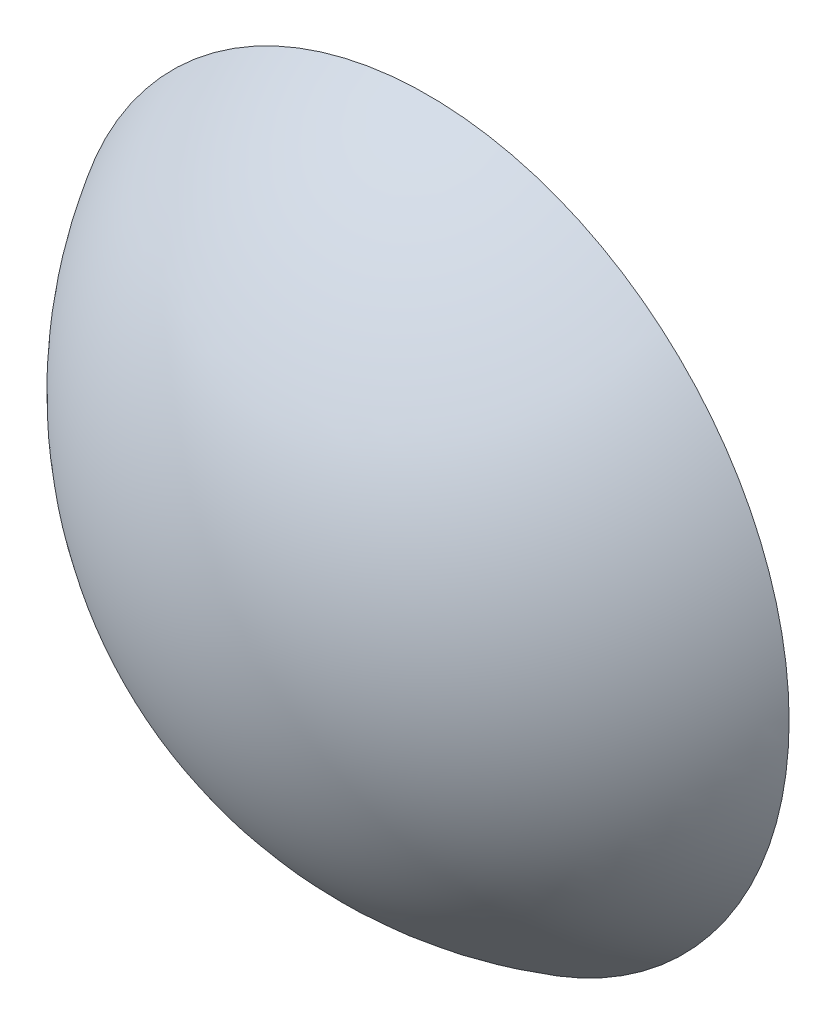
ISO-10303-21;
HEADER;
FILE_DESCRIPTION(('STEP AP214'),'2;1');
FILE_NAME('part.step','',(''),(''),'','','');
FILE_SCHEMA(('AUTOMOTIVE_DESIGN { 1 0 10303 214 1 1 1 1 }'));
ENDSEC;
DATA;
#1=APPLICATION_CONTEXT('core data for automotive mechanical design processes');
#2=APPLICATION_PROTOCOL_DEFINITION('international standard','automotive_design',2000,#1);
#3=PRODUCT_CONTEXT('',#1,'mechanical');
#4=PRODUCT('Part','Part','',(#3));
#5=PRODUCT_RELATED_PRODUCT_CATEGORY('part','',(#4));
#6=PRODUCT_DEFINITION_FORMATION('','',#4);
#7=PRODUCT_DEFINITION_CONTEXT('part definition',#1,'design');
#8=PRODUCT_DEFINITION('design','',#6,#7);
#9=PRODUCT_DEFINITION_SHAPE('','',#8);
#10=(LENGTH_UNIT() NAMED_UNIT(*) SI_UNIT(.MILLI.,.METRE.));
#11=(NAMED_UNIT(*) PLANE_ANGLE_UNIT() SI_UNIT($,.RADIAN.));
#12=(NAMED_UNIT(*) SI_UNIT($,.STERADIAN.) SOLID_ANGLE_UNIT());
#13=UNCERTAINTY_MEASURE_WITH_UNIT(LENGTH_MEASURE(1.E-05),#10,'distance_accuracy_value','');
#14=(GEOMETRIC_REPRESENTATION_CONTEXT(3) GLOBAL_UNCERTAINTY_ASSIGNED_CONTEXT((#13)) GLOBAL_UNIT_ASSIGNED_CONTEXT((#10,
#11,#12)) REPRESENTATION_CONTEXT('',''));
#15=CARTESIAN_POINT('',(0.,0.,0.));
#16=DIRECTION('',(0.,0.,1.));
#17=DIRECTION('',(1.,0.,0.));
#18=AXIS2_PLACEMENT_3D('',#15,#16,#17);
#19=CARTESIAN_POINT('',(0.,0.,0.));
#20=DIRECTION('',(0.,0.,-1.));
#21=DIRECTION('',(1.,0.,0.));
#22=AXIS2_PLACEMENT_3D('',#19,#20,#21);
#23=SPHERICAL_SURFACE('',#22,10.);
#24=CARTESIAN_POINT('',(0.,0.,5.));
#25=DIRECTION('',(0.,0.,-1.));
#26=DIRECTION('',(-1.,0.,0.));
#27=AXIS2_PLACEMENT_3D('',#24,#25,#26);
#28=CIRCLE('',#27,8.66025403784439);
#29=CARTESIAN_POINT('',(-8.66025403784439,0.,5.));
#30=VERTEX_POINT('',#29);
#31=EDGE_CURVE('E10',#30,#30,#28,.T.);
#32=ORIENTED_EDGE('',*,*,#31,.F.);
#33=EDGE_LOOP('',(#32));
#34=FACE_BOUND('',#33,.T.);
#35=ADVANCED_FACE('F41',(#34),#23,.T.);
#36=CARTESIAN_POINT('',(0.,0.,5.));
#37=DIRECTION('',(0.,0.,-1.));
#38=DIRECTION('',(-1.,0.,0.));
#39=AXIS2_PLACEMENT_3D('',#36,#37,#38);
#40=PLANE('',#39);
#41=ORIENTED_EDGE('',*,*,#31,.T.);
#42=EDGE_LOOP('',(#41));
#43=FACE_BOUND('',#42,.T.);
#44=ADVANCED_FACE('F48',(#43),#40,.T.);
#45=CLOSED_SHELL('',(#35,#44));
#46=MANIFOLD_SOLID_BREP('B2',#45);
#47=ADVANCED_BREP_SHAPE_REPRESENTATION('',(#18,#46),#14);
#48=SHAPE_DEFINITION_REPRESENTATION(#9,#47);
ENDSEC;
END-ISO-10303-21;
